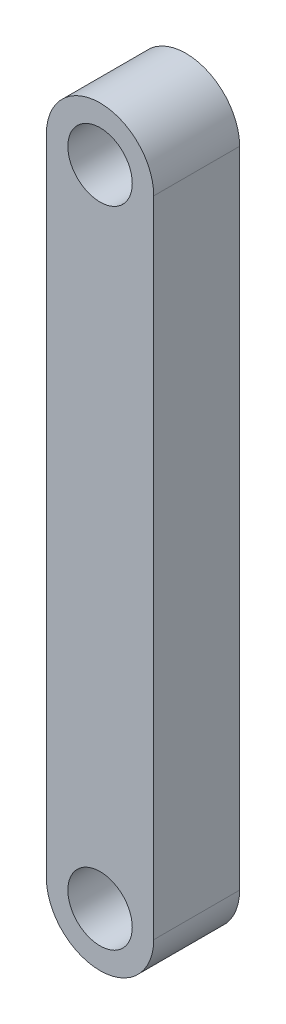
ISO-10303-21;
HEADER;
FILE_DESCRIPTION(('STEP AP214'),'2;1');
FILE_NAME('part.step','',(''),(''),'','','');
FILE_SCHEMA(('AUTOMOTIVE_DESIGN { 1 0 10303 214 1 1 1 1 }'));
ENDSEC;
DATA;
#1=APPLICATION_CONTEXT('core data for automotive mechanical design processes');
#2=APPLICATION_PROTOCOL_DEFINITION('international standard','automotive_design',2000,#1);
#3=PRODUCT_CONTEXT('',#1,'mechanical');
#4=PRODUCT('Part','Part','',(#3));
#5=PRODUCT_RELATED_PRODUCT_CATEGORY('part','',(#4));
#6=PRODUCT_DEFINITION_FORMATION('','',#4);
#7=PRODUCT_DEFINITION_CONTEXT('part definition',#1,'design');
#8=PRODUCT_DEFINITION('design','',#6,#7);
#9=PRODUCT_DEFINITION_SHAPE('','',#8);
#10=(LENGTH_UNIT() NAMED_UNIT(*) SI_UNIT(.MILLI.,.METRE.));
#11=(NAMED_UNIT(*) PLANE_ANGLE_UNIT() SI_UNIT($,.RADIAN.));
#12=(NAMED_UNIT(*) SI_UNIT($,.STERADIAN.) SOLID_ANGLE_UNIT());
#13=UNCERTAINTY_MEASURE_WITH_UNIT(LENGTH_MEASURE(1.E-05),#10,'distance_accuracy_value','');
#14=(GEOMETRIC_REPRESENTATION_CONTEXT(3) GLOBAL_UNCERTAINTY_ASSIGNED_CONTEXT((#13)) GLOBAL_UNIT_ASSIGNED_CONTEXT((#10,
#11,#12)) REPRESENTATION_CONTEXT('',''));
#15=CARTESIAN_POINT('',(0.,0.,0.));
#16=DIRECTION('',(0.,0.,1.));
#17=DIRECTION('',(1.,0.,0.));
#18=AXIS2_PLACEMENT_3D('',#15,#16,#17);
#19=CARTESIAN_POINT('',(0.,30.,4.));
#20=DIRECTION('',(0.,0.,-1.));
#21=DIRECTION('',(-1.,0.,0.));
#22=AXIS2_PLACEMENT_3D('',#19,#20,#21);
#23=CYLINDRICAL_SURFACE('',#22,2.5);
#24=CARTESIAN_POINT('',(0.,30.,0.));
#25=DIRECTION('',(0.,0.,1.));
#26=DIRECTION('',(1.,0.,0.));
#27=AXIS2_PLACEMENT_3D('',#24,#25,#26);
#28=CIRCLE('',#27,2.5);
#29=CARTESIAN_POINT('',(-2.5,30.,0.));
#30=VERTEX_POINT('',#29);
#31=CARTESIAN_POINT('',(2.5,30.,0.));
#32=VERTEX_POINT('',#31);
#33=EDGE_CURVE('E111',#30,#32,#28,.F.);
#34=ORIENTED_EDGE('',*,*,#33,.F.);
#35=DIRECTION('',(0.,0.,-1.));
#36=VECTOR('',#35,1.);
#37=CARTESIAN_POINT('',(-2.5,30.,4.));
#38=LINE('',#37,#36);
#39=CARTESIAN_POINT('',(-2.5,30.,4.));
#40=VERTEX_POINT('',#39);
#41=EDGE_CURVE('E11',#40,#30,#38,.T.);
#42=ORIENTED_EDGE('',*,*,#41,.F.);
#43=CARTESIAN_POINT('',(0.,30.,4.));
#44=DIRECTION('',(0.,0.,1.));
#45=DIRECTION('',(1.,0.,0.));
#46=AXIS2_PLACEMENT_3D('',#43,#44,#45);
#47=CIRCLE('',#46,2.5);
#48=CARTESIAN_POINT('',(2.5,30.,4.));
#49=VERTEX_POINT('',#48);
#50=EDGE_CURVE('E90',#40,#49,#47,.F.);
#51=ORIENTED_EDGE('',*,*,#50,.T.);
#52=DIRECTION('',(0.,0.,-1.));
#53=VECTOR('',#52,1.);
#54=CARTESIAN_POINT('',(2.5,30.,4.));
#55=LINE('',#54,#53);
#56=EDGE_CURVE('E57',#49,#32,#55,.T.);
#57=ORIENTED_EDGE('',*,*,#56,.T.);
#58=EDGE_LOOP('',(#34,#42,#51,#57));
#59=FACE_BOUND('',#58,.T.);
#60=ADVANCED_FACE('F41',(#59),#23,.T.);
#61=CARTESIAN_POINT('',(-2.5,0.,4.));
#62=DIRECTION('',(1.,0.,0.));
#63=DIRECTION('',(0.,1.,0.));
#64=AXIS2_PLACEMENT_3D('',#61,#62,#63);
#65=PLANE('',#64);
#66=DIRECTION('',(0.,-1.,0.));
#67=VECTOR('',#66,1.);
#68=CARTESIAN_POINT('',(-2.5,0.,0.));
#69=LINE('',#68,#67);
#70=CARTESIAN_POINT('',(-2.5,0.,0.));
#71=VERTEX_POINT('',#70);
#72=EDGE_CURVE('E96',#30,#71,#69,.T.);
#73=ORIENTED_EDGE('',*,*,#72,.T.);
#74=DIRECTION('',(0.,0.,-1.));
#75=VECTOR('',#74,1.);
#76=CARTESIAN_POINT('',(-2.5,0.,4.));
#77=LINE('',#76,#75);
#78=CARTESIAN_POINT('',(-2.5,0.,4.));
#79=VERTEX_POINT('',#78);
#80=EDGE_CURVE('E49',#79,#71,#77,.T.);
#81=ORIENTED_EDGE('',*,*,#80,.F.);
#82=DIRECTION('',(0.,-1.,0.));
#83=VECTOR('',#82,1.);
#84=CARTESIAN_POINT('',(-2.5,0.,4.));
#85=LINE('',#84,#83);
#86=EDGE_CURVE('E83',#40,#79,#85,.T.);
#87=ORIENTED_EDGE('',*,*,#86,.F.);
#88=ORIENTED_EDGE('',*,*,#41,.T.);
#89=EDGE_LOOP('',(#73,#81,#87,#88));
#90=FACE_BOUND('',#89,.T.);
#91=ADVANCED_FACE('F94',(#90),#65,.F.);
#92=CARTESIAN_POINT('',(0.,0.,4.));
#93=DIRECTION('',(0.,0.,-1.));
#94=DIRECTION('',(-1.,0.,0.));
#95=AXIS2_PLACEMENT_3D('',#92,#93,#94);
#96=CYLINDRICAL_SURFACE('',#95,2.5);
#97=CARTESIAN_POINT('',(0.,0.,0.));
#98=DIRECTION('',(0.,0.,1.));
#99=DIRECTION('',(1.,0.,0.));
#100=AXIS2_PLACEMENT_3D('',#97,#98,#99);
#101=CIRCLE('',#100,2.5);
#102=CARTESIAN_POINT('',(2.5,0.,0.));
#103=VERTEX_POINT('',#102);
#104=EDGE_CURVE('E114',#71,#103,#101,.T.);
#105=ORIENTED_EDGE('',*,*,#104,.T.);
#106=DIRECTION('',(0.,0.,-1.));
#107=VECTOR('',#106,1.);
#108=CARTESIAN_POINT('',(2.5,0.,4.));
#109=LINE('',#108,#107);
#110=CARTESIAN_POINT('',(2.5,0.,4.));
#111=VERTEX_POINT('',#110);
#112=EDGE_CURVE('E71',#111,#103,#109,.T.);
#113=ORIENTED_EDGE('',*,*,#112,.F.);
#114=CARTESIAN_POINT('',(0.,0.,4.));
#115=DIRECTION('',(0.,0.,1.));
#116=DIRECTION('',(1.,0.,0.));
#117=AXIS2_PLACEMENT_3D('',#114,#115,#116);
#118=CIRCLE('',#117,2.5);
#119=EDGE_CURVE('E89',#79,#111,#118,.T.);
#120=ORIENTED_EDGE('',*,*,#119,.F.);
#121=ORIENTED_EDGE('',*,*,#80,.T.);
#122=EDGE_LOOP('',(#105,#113,#120,#121));
#123=FACE_BOUND('',#122,.T.);
#124=ADVANCED_FACE('F99',(#123),#96,.T.);
#125=CARTESIAN_POINT('',(0.,30.,4.));
#126=DIRECTION('',(0.,0.,-1.));
#127=DIRECTION('',(-1.,0.,0.));
#128=AXIS2_PLACEMENT_3D('',#125,#126,#127);
#129=CYLINDRICAL_SURFACE('',#128,1.5);
#130=CARTESIAN_POINT('',(0.,30.,4.));
#131=DIRECTION('',(0.,0.,1.));
#132=DIRECTION('',(1.,0.,0.));
#133=AXIS2_PLACEMENT_3D('',#130,#131,#132);
#134=CIRCLE('',#133,1.5);
#135=CARTESIAN_POINT('',(1.5,30.,4.));
#136=VERTEX_POINT('',#135);
#137=EDGE_CURVE('E102',#136,#136,#134,.F.);
#138=ORIENTED_EDGE('',*,*,#137,.F.);
#139=EDGE_LOOP('',(#138));
#140=FACE_BOUND('',#139,.T.);
#141=CARTESIAN_POINT('',(0.,30.,0.));
#142=DIRECTION('',(0.,0.,1.));
#143=DIRECTION('',(1.,0.,0.));
#144=AXIS2_PLACEMENT_3D('',#141,#142,#143);
#145=CIRCLE('',#144,1.5);
#146=CARTESIAN_POINT('',(1.5,30.,0.));
#147=VERTEX_POINT('',#146);
#148=EDGE_CURVE('E119',#147,#147,#145,.F.);
#149=ORIENTED_EDGE('',*,*,#148,.T.);
#150=EDGE_LOOP('',(#149));
#151=FACE_BOUND('',#150,.T.);
#152=ADVANCED_FACE('F131',(#140,#151),#129,.F.);
#153=CARTESIAN_POINT('',(2.5,0.,4.));
#154=DIRECTION('',(1.,0.,0.));
#155=DIRECTION('',(0.,1.,0.));
#156=AXIS2_PLACEMENT_3D('',#153,#154,#155);
#157=PLANE('',#156);
#158=DIRECTION('',(0.,-1.,0.));
#159=VECTOR('',#158,1.);
#160=CARTESIAN_POINT('',(2.5,0.,0.));
#161=LINE('',#160,#159);
#162=EDGE_CURVE('E116',#32,#103,#161,.T.);
#163=ORIENTED_EDGE('',*,*,#162,.F.);
#164=ORIENTED_EDGE('',*,*,#56,.F.);
#165=DIRECTION('',(0.,-1.,0.));
#166=VECTOR('',#165,1.);
#167=CARTESIAN_POINT('',(2.5,0.,4.));
#168=LINE('',#167,#166);
#169=EDGE_CURVE('E100',#49,#111,#168,.T.);
#170=ORIENTED_EDGE('',*,*,#169,.T.);
#171=ORIENTED_EDGE('',*,*,#112,.T.);
#172=EDGE_LOOP('',(#163,#164,#170,#171));
#173=FACE_BOUND('',#172,.T.);
#174=ADVANCED_FACE('F128',(#173),#157,.T.);
#175=CARTESIAN_POINT('',(0.,0.,4.));
#176=DIRECTION('',(0.,0.,-1.));
#177=DIRECTION('',(-1.,0.,0.));
#178=AXIS2_PLACEMENT_3D('',#175,#176,#177);
#179=CYLINDRICAL_SURFACE('',#178,1.5);
#180=CARTESIAN_POINT('',(0.,0.,4.));
#181=DIRECTION('',(0.,0.,1.));
#182=DIRECTION('',(1.,0.,0.));
#183=AXIS2_PLACEMENT_3D('',#180,#181,#182);
#184=CIRCLE('',#183,1.5);
#185=CARTESIAN_POINT('',(1.5,0.,4.));
#186=VERTEX_POINT('',#185);
#187=EDGE_CURVE('E108',#186,#186,#184,.T.);
#188=ORIENTED_EDGE('',*,*,#187,.T.);
#189=EDGE_LOOP('',(#188));
#190=FACE_BOUND('',#189,.T.);
#191=CARTESIAN_POINT('',(0.,0.,0.));
#192=DIRECTION('',(0.,0.,1.));
#193=DIRECTION('',(1.,0.,0.));
#194=AXIS2_PLACEMENT_3D('',#191,#192,#193);
#195=CIRCLE('',#194,1.5);
#196=CARTESIAN_POINT('',(1.5,0.,0.));
#197=VERTEX_POINT('',#196);
#198=EDGE_CURVE('E122',#197,#197,#195,.T.);
#199=ORIENTED_EDGE('',*,*,#198,.F.);
#200=EDGE_LOOP('',(#199));
#201=FACE_BOUND('',#200,.T.);
#202=ADVANCED_FACE('F130',(#190,#201),#179,.F.);
#203=CARTESIAN_POINT('',(0.,0.,4.));
#204=DIRECTION('',(0.,0.,1.));
#205=DIRECTION('',(1.,0.,0.));
#206=AXIS2_PLACEMENT_3D('',#203,#204,#205);
#207=PLANE('',#206);
#208=ORIENTED_EDGE('',*,*,#50,.F.);
#209=ORIENTED_EDGE('',*,*,#86,.T.);
#210=ORIENTED_EDGE('',*,*,#119,.T.);
#211=ORIENTED_EDGE('',*,*,#169,.F.);
#212=EDGE_LOOP('',(#208,#209,#210,#211));
#213=FACE_BOUND('',#212,.T.);
#214=ORIENTED_EDGE('',*,*,#137,.T.);
#215=EDGE_LOOP('',(#214));
#216=FACE_BOUND('',#215,.T.);
#217=ORIENTED_EDGE('',*,*,#187,.F.);
#218=EDGE_LOOP('',(#217));
#219=FACE_BOUND('',#218,.T.);
#220=ADVANCED_FACE('F85',(#213,#216,#219),#207,.T.);
#221=CARTESIAN_POINT('',(0.,0.,0.));
#222=DIRECTION('',(0.,0.,1.));
#223=DIRECTION('',(1.,0.,0.));
#224=AXIS2_PLACEMENT_3D('',#221,#222,#223);
#225=PLANE('',#224);
#226=ORIENTED_EDGE('',*,*,#33,.T.);
#227=ORIENTED_EDGE('',*,*,#162,.T.);
#228=ORIENTED_EDGE('',*,*,#104,.F.);
#229=ORIENTED_EDGE('',*,*,#72,.F.);
#230=EDGE_LOOP('',(#226,#227,#228,#229));
#231=FACE_BOUND('',#230,.T.);
#232=ORIENTED_EDGE('',*,*,#148,.F.);
#233=EDGE_LOOP('',(#232));
#234=FACE_BOUND('',#233,.T.);
#235=ORIENTED_EDGE('',*,*,#198,.T.);
#236=EDGE_LOOP('',(#235));
#237=FACE_BOUND('',#236,.T.);
#238=ADVANCED_FACE('F176',(#231,#234,#237),#225,.F.);
#239=CLOSED_SHELL('',(#60,#91,#124,#152,#174,#202,#220,#238));
#240=MANIFOLD_SOLID_BREP('B2',#239);
#241=ADVANCED_BREP_SHAPE_REPRESENTATION('',(#18,#240),#14);
#242=SHAPE_DEFINITION_REPRESENTATION(#9,#241);
ENDSEC;
END-ISO-10303-21;
